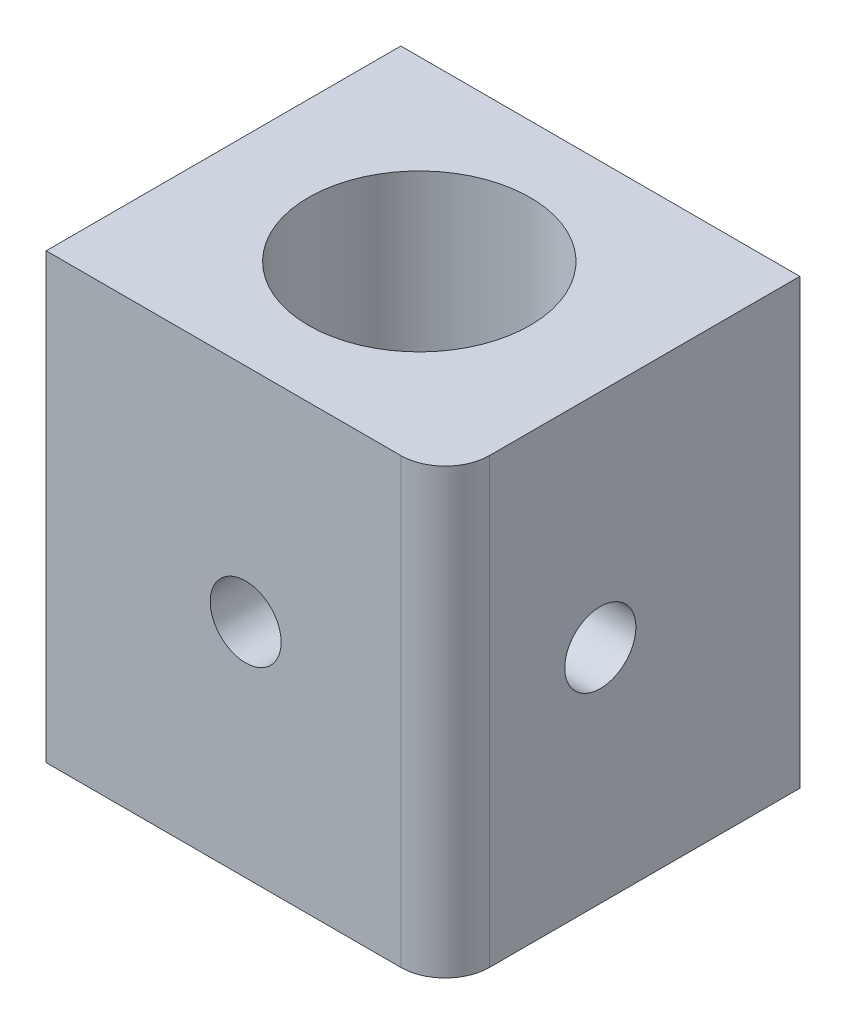
ISO-10303-21;
HEADER;
FILE_DESCRIPTION(('STEP AP214'),'2;1');
FILE_NAME('part.step','',(''),(''),'','','');
FILE_SCHEMA(('AUTOMOTIVE_DESIGN { 1 0 10303 214 1 1 1 1 }'));
ENDSEC;
DATA;
#1=APPLICATION_CONTEXT('core data for automotive mechanical design processes');
#2=APPLICATION_PROTOCOL_DEFINITION('international standard','automotive_design',2000,#1);
#3=PRODUCT_CONTEXT('',#1,'mechanical');
#4=PRODUCT('Part','Part','',(#3));
#5=PRODUCT_RELATED_PRODUCT_CATEGORY('part','',(#4));
#6=PRODUCT_DEFINITION_FORMATION('','',#4);
#7=PRODUCT_DEFINITION_CONTEXT('part definition',#1,'design');
#8=PRODUCT_DEFINITION('design','',#6,#7);
#9=PRODUCT_DEFINITION_SHAPE('','',#8);
#10=(LENGTH_UNIT() NAMED_UNIT(*) SI_UNIT(.MILLI.,.METRE.));
#11=(NAMED_UNIT(*) PLANE_ANGLE_UNIT() SI_UNIT($,.RADIAN.));
#12=(NAMED_UNIT(*) SI_UNIT($,.STERADIAN.) SOLID_ANGLE_UNIT());
#13=UNCERTAINTY_MEASURE_WITH_UNIT(LENGTH_MEASURE(1.E-05),#10,'distance_accuracy_value','');
#14=(GEOMETRIC_REPRESENTATION_CONTEXT(3) GLOBAL_UNCERTAINTY_ASSIGNED_CONTEXT((#13)) GLOBAL_UNIT_ASSIGNED_CONTEXT((#10,
#11,#12)) REPRESENTATION_CONTEXT('',''));
#15=CARTESIAN_POINT('',(0.,0.,0.));
#16=DIRECTION('',(0.,0.,1.));
#17=DIRECTION('',(1.,0.,0.));
#18=AXIS2_PLACEMENT_3D('',#15,#16,#17);
#19=CARTESIAN_POINT('',(0.,20.,0.));
#20=DIRECTION('',(0.,1.,0.));
#21=DIRECTION('',(0.,0.,1.));
#22=AXIS2_PLACEMENT_3D('',#19,#20,#21);
#23=PLANE('',#22);
#24=DIRECTION('',(1.,0.,0.));
#25=VECTOR('',#24,1.);
#26=CARTESIAN_POINT('',(-24.0371296342417,20.,4.76598259989276));
#27=LINE('',#26,#25);
#28=CARTESIAN_POINT('',(-24.0371296342417,20.,4.76598259989276));
#29=VERTEX_POINT('',#28);
#30=CARTESIAN_POINT('',(-8.03712963424174,20.,4.76598259989276));
#31=VERTEX_POINT('',#30);
#32=EDGE_CURVE('E76',#29,#31,#27,.T.);
#33=ORIENTED_EDGE('',*,*,#32,.T.);
#34=CARTESIAN_POINT('',(-8.03712963424174,20.,2.76598259989276));
#35=DIRECTION('',(0.,1.,0.));
#36=DIRECTION('',(0.,0.,1.));
#37=AXIS2_PLACEMENT_3D('',#34,#35,#36);
#38=CIRCLE('',#37,2.);
#39=CARTESIAN_POINT('',(-6.03712963424174,20.,2.76598259989276));
#40=VERTEX_POINT('',#39);
#41=EDGE_CURVE('E11',#31,#40,#38,.T.);
#42=ORIENTED_EDGE('',*,*,#41,.T.);
#43=DIRECTION('',(0.,0.,-1.));
#44=VECTOR('',#43,1.);
#45=CARTESIAN_POINT('',(-6.03712963424174,20.,-11.2340174001072));
#46=LINE('',#45,#44);
#47=CARTESIAN_POINT('',(-6.03712963424174,20.,-11.2340174001072));
#48=VERTEX_POINT('',#47);
#49=EDGE_CURVE('E84',#40,#48,#46,.T.);
#50=ORIENTED_EDGE('',*,*,#49,.T.);
#51=DIRECTION('',(-1.,0.,0.));
#52=VECTOR('',#51,1.);
#53=CARTESIAN_POINT('',(-24.0371296342417,20.,-11.2340174001072));
#54=LINE('',#53,#52);
#55=CARTESIAN_POINT('',(-24.0371296342417,20.,-11.2340174001072));
#56=VERTEX_POINT('',#55);
#57=EDGE_CURVE('E90',#48,#56,#54,.T.);
#58=ORIENTED_EDGE('',*,*,#57,.T.);
#59=DIRECTION('',(0.,0.,1.));
#60=VECTOR('',#59,1.);
#61=CARTESIAN_POINT('',(-24.0371296342417,20.,-11.2340174001072));
#62=LINE('',#61,#60);
#63=EDGE_CURVE('E85',#56,#29,#62,.T.);
#64=ORIENTED_EDGE('',*,*,#63,.T.);
#65=EDGE_LOOP('',(#33,#42,#50,#58,#64));
#66=FACE_BOUND('',#65,.T.);
#67=CARTESIAN_POINT('',(-15.2043179720073,20.,-3.23401740010724));
#68=DIRECTION('',(0.,1.,0.));
#69=DIRECTION('',(0.,0.,1.));
#70=AXIS2_PLACEMENT_3D('',#67,#68,#69);
#71=CIRCLE('',#70,5.);
#72=CARTESIAN_POINT('',(-15.2043179720073,20.,1.76598259989276));
#73=VERTEX_POINT('',#72);
#74=EDGE_CURVE('E222',#73,#73,#71,.T.);
#75=ORIENTED_EDGE('',*,*,#74,.F.);
#76=EDGE_LOOP('',(#75));
#77=FACE_BOUND('',#76,.T.);
#78=ADVANCED_FACE('F33',(#66,#77),#23,.T.);
#79=CARTESIAN_POINT('',(0.,0.,0.));
#80=DIRECTION('',(0.,1.,0.));
#81=DIRECTION('',(0.,0.,1.));
#82=AXIS2_PLACEMENT_3D('',#79,#80,#81);
#83=PLANE('',#82);
#84=DIRECTION('',(0.,0.,-1.));
#85=VECTOR('',#84,1.);
#86=CARTESIAN_POINT('',(-6.03712963424174,0.,-11.2340174001072));
#87=LINE('',#86,#85);
#88=CARTESIAN_POINT('',(-6.03712963424174,0.,2.76598259989276));
#89=VERTEX_POINT('',#88);
#90=CARTESIAN_POINT('',(-6.03712963424174,0.,-11.2340174001072));
#91=VERTEX_POINT('',#90);
#92=EDGE_CURVE('E235',#89,#91,#87,.T.);
#93=ORIENTED_EDGE('',*,*,#92,.F.);
#94=CARTESIAN_POINT('',(-8.03712963424174,0.,2.76598259989276));
#95=DIRECTION('',(0.,1.,0.));
#96=DIRECTION('',(0.,0.,1.));
#97=AXIS2_PLACEMENT_3D('',#94,#95,#96);
#98=CIRCLE('',#97,2.);
#99=CARTESIAN_POINT('',(-8.03712963424174,0.,4.76598259989276));
#100=VERTEX_POINT('',#99);
#101=EDGE_CURVE('E55',#89,#100,#98,.F.);
#102=ORIENTED_EDGE('',*,*,#101,.T.);
#103=DIRECTION('',(1.,0.,0.));
#104=VECTOR('',#103,1.);
#105=CARTESIAN_POINT('',(-24.0371296342417,0.,4.76598259989276));
#106=LINE('',#105,#104);
#107=CARTESIAN_POINT('',(-24.0371296342417,0.,4.76598259989276));
#108=VERTEX_POINT('',#107);
#109=EDGE_CURVE('E233',#108,#100,#106,.T.);
#110=ORIENTED_EDGE('',*,*,#109,.F.);
#111=DIRECTION('',(0.,0.,1.));
#112=VECTOR('',#111,1.);
#113=CARTESIAN_POINT('',(-24.0371296342417,0.,-11.2340174001072));
#114=LINE('',#113,#112);
#115=CARTESIAN_POINT('',(-24.0371296342417,0.,-11.2340174001072));
#116=VERTEX_POINT('',#115);
#117=EDGE_CURVE('E98',#116,#108,#114,.T.);
#118=ORIENTED_EDGE('',*,*,#117,.F.);
#119=DIRECTION('',(-1.,0.,0.));
#120=VECTOR('',#119,1.);
#121=CARTESIAN_POINT('',(-24.0371296342417,0.,-11.2340174001072));
#122=LINE('',#121,#120);
#123=EDGE_CURVE('E94',#91,#116,#122,.T.);
#124=ORIENTED_EDGE('',*,*,#123,.F.);
#125=EDGE_LOOP('',(#93,#102,#110,#118,#124));
#126=FACE_BOUND('',#125,.T.);
#127=CARTESIAN_POINT('',(-15.2043179720073,0.,-3.23401740010724));
#128=DIRECTION('',(0.,1.,0.));
#129=DIRECTION('',(0.,0.,1.));
#130=AXIS2_PLACEMENT_3D('',#127,#128,#129);
#131=CIRCLE('',#130,5.);
#132=CARTESIAN_POINT('',(-15.2043179720073,0.,1.76598259989276));
#133=VERTEX_POINT('',#132);
#134=EDGE_CURVE('E116',#133,#133,#131,.T.);
#135=ORIENTED_EDGE('',*,*,#134,.T.);
#136=EDGE_LOOP('',(#135));
#137=FACE_BOUND('',#136,.T.);
#138=ADVANCED_FACE('F140',(#126,#137),#83,.F.);
#139=CARTESIAN_POINT('',(-24.0371296342417,20.,-11.2340174001072));
#140=DIRECTION('',(1.,0.,0.));
#141=DIRECTION('',(0.,0.,-1.));
#142=AXIS2_PLACEMENT_3D('',#139,#140,#141);
#143=PLANE('',#142);
#144=ORIENTED_EDGE('',*,*,#117,.T.);
#145=DIRECTION('',(0.,-1.,0.));
#146=VECTOR('',#145,1.);
#147=CARTESIAN_POINT('',(-24.0371296342417,20.,4.76598259989276));
#148=LINE('',#147,#146);
#149=EDGE_CURVE('E80',#29,#108,#148,.T.);
#150=ORIENTED_EDGE('',*,*,#149,.F.);
#151=ORIENTED_EDGE('',*,*,#63,.F.);
#152=DIRECTION('',(0.,-1.,0.));
#153=VECTOR('',#152,1.);
#154=CARTESIAN_POINT('',(-24.0371296342417,20.,-11.2340174001072));
#155=LINE('',#154,#153);
#156=EDGE_CURVE('E105',#56,#116,#155,.T.);
#157=ORIENTED_EDGE('',*,*,#156,.T.);
#158=EDGE_LOOP('',(#144,#150,#151,#157));
#159=FACE_BOUND('',#158,.T.);
#160=ADVANCED_FACE('F96',(#159),#143,.F.);
#161=CARTESIAN_POINT('',(-24.0371296342417,20.,4.76598259989276));
#162=DIRECTION('',(0.,0.,-1.));
#163=DIRECTION('',(-1.,0.,0.));
#164=AXIS2_PLACEMENT_3D('',#161,#162,#163);
#165=PLANE('',#164);
#166=CARTESIAN_POINT('',(-15.0371296342417,10.,4.76598259989276));
#167=DIRECTION('',(0.,0.,1.));
#168=DIRECTION('',(1.,0.,0.));
#169=AXIS2_PLACEMENT_3D('',#166,#167,#168);
#170=CIRCLE('',#169,1.6);
#171=CARTESIAN_POINT('',(-13.4371296342417,10.,4.76598259989276));
#172=VERTEX_POINT('',#171);
#173=EDGE_CURVE('E245',#172,#172,#170,.T.);
#174=ORIENTED_EDGE('',*,*,#173,.F.);
#175=EDGE_LOOP('',(#174));
#176=FACE_BOUND('',#175,.T.);
#177=ORIENTED_EDGE('',*,*,#109,.T.);
#178=DIRECTION('',(0.,-1.,0.));
#179=VECTOR('',#178,1.);
#180=CARTESIAN_POINT('',(-8.03712963424174,20.,4.76598259989276));
#181=LINE('',#180,#179);
#182=EDGE_CURVE('E41',#100,#31,#181,.F.);
#183=ORIENTED_EDGE('',*,*,#182,.T.);
#184=ORIENTED_EDGE('',*,*,#32,.F.);
#185=ORIENTED_EDGE('',*,*,#149,.T.);
#186=EDGE_LOOP('',(#177,#183,#184,#185));
#187=FACE_BOUND('',#186,.T.);
#188=ADVANCED_FACE('F78',(#176,#187),#165,.F.);
#189=CARTESIAN_POINT('',(-6.03712963424174,20.,-11.2340174001072));
#190=DIRECTION('',(-1.,0.,0.));
#191=DIRECTION('',(0.,0.,1.));
#192=AXIS2_PLACEMENT_3D('',#189,#190,#191);
#193=PLANE('',#192);
#194=CARTESIAN_POINT('',(-6.03712963424174,10.,-2.23401740010724));
#195=DIRECTION('',(1.,0.,0.));
#196=DIRECTION('',(0.,0.,-1.));
#197=AXIS2_PLACEMENT_3D('',#194,#195,#196);
#198=CIRCLE('',#197,1.605);
#199=CARTESIAN_POINT('',(-6.03712963424174,10.,-3.83901740010724));
#200=VERTEX_POINT('',#199);
#201=EDGE_CURVE('E117',#200,#200,#198,.T.);
#202=ORIENTED_EDGE('',*,*,#201,.F.);
#203=EDGE_LOOP('',(#202));
#204=FACE_BOUND('',#203,.T.);
#205=ORIENTED_EDGE('',*,*,#49,.F.);
#206=DIRECTION('',(0.,-1.,0.));
#207=VECTOR('',#206,1.);
#208=CARTESIAN_POINT('',(-6.03712963424174,20.,2.76598259989276));
#209=LINE('',#208,#207);
#210=EDGE_CURVE('E99',#40,#89,#209,.T.);
#211=ORIENTED_EDGE('',*,*,#210,.T.);
#212=ORIENTED_EDGE('',*,*,#92,.T.);
#213=DIRECTION('',(0.,-1.,0.));
#214=VECTOR('',#213,1.);
#215=CARTESIAN_POINT('',(-6.03712963424174,20.,-11.2340174001072));
#216=LINE('',#215,#214);
#217=EDGE_CURVE('E100',#48,#91,#216,.T.);
#218=ORIENTED_EDGE('',*,*,#217,.F.);
#219=EDGE_LOOP('',(#205,#211,#212,#218));
#220=FACE_BOUND('',#219,.T.);
#221=ADVANCED_FACE('F149',(#204,#220),#193,.F.);
#222=CARTESIAN_POINT('',(-24.0371296342417,20.,-11.2340174001072));
#223=DIRECTION('',(0.,0.,1.));
#224=DIRECTION('',(1.,0.,0.));
#225=AXIS2_PLACEMENT_3D('',#222,#223,#224);
#226=PLANE('',#225);
#227=ORIENTED_EDGE('',*,*,#123,.T.);
#228=ORIENTED_EDGE('',*,*,#156,.F.);
#229=ORIENTED_EDGE('',*,*,#57,.F.);
#230=ORIENTED_EDGE('',*,*,#217,.T.);
#231=EDGE_LOOP('',(#227,#228,#229,#230));
#232=FACE_BOUND('',#231,.T.);
#233=ADVANCED_FACE('F146',(#232),#226,.F.);
#234=CARTESIAN_POINT('',(-15.2043179720073,20.,-3.23401740010724));
#235=DIRECTION('',(0.,-1.,0.));
#236=DIRECTION('',(0.,0.,-1.));
#237=AXIS2_PLACEMENT_3D('',#234,#235,#236);
#238=CYLINDRICAL_SURFACE('',#237,5.);
#239=CARTESIAN_POINT('',(-13.4371296342417,10.,1.44327298844739));
#240=CARTESIAN_POINT('',(-13.4371297978285,9.91330768960326,1.44327321058091));
#241=CARTESIAN_POINT('',(-13.4442008000116,9.82661295536014,1.44596300897748));
#242=CARTESIAN_POINT('',(-13.4721948591757,9.65579895829562,1.45639480744616));
#243=CARTESIAN_POINT('',(-13.4931214782064,9.57168036357674,1.4641381066823));
#244=CARTESIAN_POINT('',(-13.5479792288643,9.40854065917317,1.48375543117041));
#245=CARTESIAN_POINT('',(-13.5818820071374,9.32950887139692,1.49562044514796));
#246=CARTESIAN_POINT('',(-13.6616159834312,9.17824765335041,1.52222382481139));
#247=CARTESIAN_POINT('',(-13.7074497380378,9.10601968553502,1.53696280616484));
#248=CARTESIAN_POINT('',(-13.8118439725969,8.96728310260458,1.56849210846646));
#249=CARTESIAN_POINT('',(-13.8708336685676,8.90111062046994,1.5853402677285));
#250=CARTESIAN_POINT('',(-13.9989264669206,8.77936710681761,1.61896227248119));
#251=CARTESIAN_POINT('',(-14.0680316707358,8.72379828368216,1.63573610178246));
#252=CARTESIAN_POINT('',(-14.217300846121,8.62294893875321,1.66820887241483));
#253=CARTESIAN_POINT('',(-14.297766010703,8.57809382987326,1.68385008056657));
#254=CARTESIAN_POINT('',(-14.4656786027125,8.50269995224867,1.71185403974506));
#255=CARTESIAN_POINT('',(-14.5531245021377,8.47215806050745,1.72421750568548));
#256=CARTESIAN_POINT('',(-14.7297909366968,8.42723189798769,1.74418371296284));
#257=CARTESIAN_POINT('',(-14.8188805464769,8.41239246153338,1.75191756662629));
#258=CARTESIAN_POINT('',(-14.9985627460656,8.39792956760167,1.76255689958001));
#259=CARTESIAN_POINT('',(-15.0891548845081,8.39830162041377,1.76546380329348));
#260=CARTESIAN_POINT('',(-15.2650698923919,8.41396652573768,1.7663540891885));
#261=CARTESIAN_POINT('',(-15.3504505077735,8.42860936608146,1.76454622310554));
#262=CARTESIAN_POINT('',(-15.5175596346818,8.47139715810064,1.75686217172063));
#263=CARTESIAN_POINT('',(-15.5992880664556,8.49954240447214,1.75098589762261));
#264=CARTESIAN_POINT('',(-15.7571433396818,8.5685580926808,1.73596216841026));
#265=CARTESIAN_POINT('',(-15.8332521187056,8.6094675314762,1.72680467567088));
#266=CARTESIAN_POINT('',(-15.9777191105648,8.70281381380134,1.70634508719652));
#267=CARTESIAN_POINT('',(-16.0460755705098,8.75525325655454,1.6950425079707));
#268=CARTESIAN_POINT('',(-16.17593549549,8.8725803313777,1.67113224498378));
#269=CARTESIAN_POINT('',(-16.2370645443493,8.93787585640268,1.65849074379883));
#270=CARTESIAN_POINT('',(-16.3476686631787,9.07780546915048,1.63383309195305));
#271=CARTESIAN_POINT('',(-16.3971420840139,9.15244087607255,1.62181702997171));
#272=CARTESIAN_POINT('',(-16.4837924279344,9.3104917112299,1.59971682051182));
#273=CARTESIAN_POINT('',(-16.5207482895416,9.39403381087474,1.58966860711185));
#274=CARTESIAN_POINT('',(-16.5799783863294,9.56649755800163,1.57311418571265));
#275=CARTESIAN_POINT('',(-16.6022567888972,9.65541767066294,1.56660697240472));
#276=CARTESIAN_POINT('',(-16.6308658966188,9.83312347380873,1.55818235451635));
#277=CARTESIAN_POINT('',(-16.6376763461017,9.92182535635771,1.556126972127));
#278=CARTESIAN_POINT('',(-16.636514402944,10.0991155206637,1.55647472316716));
#279=CARTESIAN_POINT('',(-16.6285440944166,10.1877038166742,1.55887722802666));
#280=CARTESIAN_POINT('',(-16.5985190366197,10.3598661232994,1.56769420429775));
#281=CARTESIAN_POINT('',(-16.5768337141209,10.4435105570392,1.57400335581952));
#282=CARTESIAN_POINT('',(-16.5204356077066,10.6059703709638,1.58974519741327));
#283=CARTESIAN_POINT('',(-16.4857208540458,10.6847850189012,1.59917835973726));
#284=CARTESIAN_POINT('',(-16.4032808097349,10.8374598951514,1.62029356722845));
#285=CARTESIAN_POINT('',(-16.3552613382165,10.9111543354669,1.63202445653823));
#286=CARTESIAN_POINT('',(-16.2478848484674,11.0496442152035,1.65617591839536));
#287=CARTESIAN_POINT('',(-16.1885252896979,11.1144376549162,1.66859664504504));
#288=CARTESIAN_POINT('',(-16.0577489647108,11.2355324394542,1.69307301227166));
#289=CARTESIAN_POINT('',(-15.9859933400676,11.2914741038523,1.70510225162039));
#290=CARTESIAN_POINT('',(-15.8337877784238,11.3905313904881,1.72679574085982));
#291=CARTESIAN_POINT('',(-15.7533386632074,11.4336482235968,1.73646021400731));
#292=CARTESIAN_POINT('',(-15.5870218979065,11.5052272226575,1.75200489967387));
#293=CARTESIAN_POINT('',(-15.5012354081293,11.5338674010917,1.75793131406086));
#294=CARTESIAN_POINT('',(-15.3258886538135,11.5763085755883,1.76527343362268));
#295=CARTESIAN_POINT('',(-15.2363295183397,11.5901139790216,1.76669047876427));
#296=CARTESIAN_POINT('',(-15.0598049176822,11.6021867503085,1.76464248679779));
#297=CARTESIAN_POINT('',(-14.972877273924,11.6010480567704,1.76136865094393));
#298=CARTESIAN_POINT('',(-14.8006321020044,11.5847877051918,1.7504068798384));
#299=CARTESIAN_POINT('',(-14.7153145370809,11.569666366805,1.74271904549558));
#300=CARTESIAN_POINT('',(-14.5490366846159,11.5261451732636,1.72356105593821));
#301=CARTESIAN_POINT('',(-14.4680577819444,11.4978081389078,1.71210886978396));
#302=CARTESIAN_POINT('',(-14.3120237578303,11.4288117558339,1.68635573741275));
#303=CARTESIAN_POINT('',(-14.2369698865903,11.3881498152296,1.67205419220222));
#304=CARTESIAN_POINT('',(-14.091505375896,11.2936874003087,1.64116558534691));
#305=CARTESIAN_POINT('',(-14.0214206786852,11.2394081413975,1.62450790576108));
#306=CARTESIAN_POINT('',(-13.8911613282817,11.1200730345192,1.59093367130789));
#307=CARTESIAN_POINT('',(-13.8309900385605,11.0550135439348,1.57401703069776));
#308=CARTESIAN_POINT('',(-13.7201438233949,10.9131956868645,1.54098976372153));
#309=CARTESIAN_POINT('',(-13.6698743613237,10.8361078805214,1.52492798085902));
#310=CARTESIAN_POINT('',(-13.5831056749187,10.6739859912229,1.49607488316681));
#311=CARTESIAN_POINT('',(-13.5466001787147,10.5889555496067,1.48328207960937));
#312=CARTESIAN_POINT('',(-13.4911327481672,10.4207814439479,1.46340664291538));
#313=CARTESIAN_POINT('',(-13.4709473470338,10.338087347992,1.45593231572115));
#314=CARTESIAN_POINT('',(-13.4439479748076,10.1702623901729,1.44586620649346));
#315=CARTESIAN_POINT('',(-13.4371294735985,10.0851323637872,1.44327277031095));
#316=CARTESIAN_POINT('',(-13.4371296342417,10.,1.44327298844739));
#317=B_SPLINE_CURVE_WITH_KNOTS('',3,(#239,#240,#241,#242,#243,#244,#245,#246,#247,#248,#249,
#250,#251,#252,#253,#254,#255,#256,#257,#258,#259,#260,#261,#262,#263,#264,#265,#266,#267,#268,
#269,#270,#271,#272,#273,#274,#275,#276,#277,#278,#279,#280,#281,#282,#283,#284,#285,#286,#287,
#288,#289,#290,#291,#292,#293,#294,#295,#296,#297,#298,#299,#300,#301,#302,#303,#304,#305,#306,
#307,#308,#309,#310,#311,#312,#313,#314,#315,#316),.UNSPECIFIED.,.T.,.F.,(4,2,2,2,2,2,2,2,2,2,2,
2,2,2,2,2,2,2,2,2,2,2,2,2,2,2,2,2,2,2,2,2,2,2,2,2,2,2,4),(0.,0.259759425520296,
0.519585656829485,0.778847370374539,1.03816468466909,1.30766877841798,1.57722893960732,
1.85617139314305,2.13505295593891,2.40560846041119,2.67608411030117,2.93478948652545,
3.19350050936803,3.45300981226106,3.71257767675686,3.98233631431976,4.25213309667999,
4.52647245507919,4.80073388639105,5.06636555584746,5.33195977361342,5.59068805037071,
5.84945545655801,6.11447718333956,6.37955835316057,6.65357093538655,6.92755763818481,
7.19808788982723,7.46853774543461,7.72827251644347,7.98800134986664,8.24650795329257,
8.50506895754397,8.7744548089226,9.04393187152233,9.32282845661837,9.60159780198451,
9.85676959498431,10.1118548938919),.UNSPECIFIED.);
#318=CARTESIAN_POINT('',(-13.4371296342417,10.,1.44327298844739));
#319=VERTEX_POINT('',#318);
#320=EDGE_CURVE('E118',#319,#319,#317,.T.);
#321=ORIENTED_EDGE('',*,*,#320,.F.);
#322=EDGE_LOOP('',(#321));
#323=FACE_BOUND('',#322,.T.);
#324=CARTESIAN_POINT('',(-10.2410554361343,10.,-3.83901740010724));
#325=CARTESIAN_POINT('',(-10.2410550617484,9.9099767213553,-3.83901681619751));
#326=CARTESIAN_POINT('',(-10.2401120072365,9.81994790970595,-3.83142354524601));
#327=CARTESIAN_POINT('',(-10.2365774992307,9.64245756263025,-3.80127428987307));
#328=CARTESIAN_POINT('',(-10.2339857984032,9.55499641447052,-3.77871606035308));
#329=CARTESIAN_POINT('',(-10.2278349708213,9.38514770816522,-3.71930314905972));
#330=CARTESIAN_POINT('',(-10.2242761910322,9.30275834335976,-3.68245359266048));
#331=CARTESIAN_POINT('',(-10.2172111672369,9.14529977410104,-3.59548803755307));
#332=CARTESIAN_POINT('',(-10.213704925742,9.07023091865287,-3.54537140676016));
#333=CARTESIAN_POINT('',(-10.2079627274658,8.92921728072772,-3.43302046354152));
#334=CARTESIAN_POINT('',(-10.2057319950107,8.86331084815476,-3.37073769670794));
#335=CARTESIAN_POINT('',(-10.2038652530581,8.74289395160999,-3.23595194711327));
#336=CARTESIAN_POINT('',(-10.2042289035819,8.68838199542216,-3.16345030469676));
#337=CARTESIAN_POINT('',(-10.2087037300188,8.59304353144469,-3.01146893109314));
#338=CARTESIAN_POINT('',(-10.2127619727129,8.55203482906957,-2.93210205498619));
#339=CARTESIAN_POINT('',(-10.2254044424685,8.48382329725462,-2.76798913764337));
#340=CARTESIAN_POINT('',(-10.2339877103687,8.45661754442615,-2.68324423972424));
#341=CARTESIAN_POINT('',(-10.2558327167702,8.41710414407201,-2.5131368647855));
#342=CARTESIAN_POINT('',(-10.2689764748081,8.40445260246707,-2.42783871766849));
#343=CARTESIAN_POINT('',(-10.2999034044278,8.3928884115697,-2.25716479119415));
#344=CARTESIAN_POINT('',(-10.3176868793089,8.39397666067048,-2.17178900712539));
#345=CARTESIAN_POINT('',(-10.3576757013584,8.40953415688217,-2.00203759250084));
#346=CARTESIAN_POINT('',(-10.3799410221364,8.42419581768779,-1.91769405549681));
#347=CARTESIAN_POINT('',(-10.4278368886057,8.46633462153229,-1.75328425071444));
#348=CARTESIAN_POINT('',(-10.4534683657954,8.49381531730528,-1.67321917555179));
#349=CARTESIAN_POINT('',(-10.508720908764,8.56283928609446,-1.5138592698282));
#350=CARTESIAN_POINT('',(-10.5384939379689,8.60519627620665,-1.43496981852352));
#351=CARTESIAN_POINT('',(-10.598914262867,8.70220770076061,-1.28548761135581));
#352=CARTESIAN_POINT('',(-10.6295620450545,8.75686909943859,-1.21489958864299));
#353=CARTESIAN_POINT('',(-10.691773925329,8.88124167679092,-1.07928804184063));
#354=CARTESIAN_POINT('',(-10.7232716478329,8.95169076885247,-1.01490727833303));
#355=CARTESIAN_POINT('',(-10.7825476870763,9.10391817760275,-0.899024267603946));
#356=CARTESIAN_POINT('',(-10.8103261010742,9.18569619793087,-0.847521683592836));
#357=CARTESIAN_POINT('',(-10.8584350170452,9.35572219505444,-0.761028536514226));
#358=CARTESIAN_POINT('',(-10.8789955406602,9.44363601664552,-0.725515227078706));
#359=CARTESIAN_POINT('',(-10.9114461005528,9.62578265326872,-0.670367478398624));
#360=CARTESIAN_POINT('',(-10.9233499968135,9.72000510229133,-0.650707650885347));
#361=CARTESIAN_POINT('',(-10.9358572413835,9.89804651313954,-0.630104932455999));
#362=CARTESIAN_POINT('',(-10.9377850205975,9.98152290481335,-0.626967347048799));
#363=CARTESIAN_POINT('',(-10.9336952412185,10.1477483287781,-0.633671476563658));
#364=CARTESIAN_POINT('',(-10.9276792097296,10.2304974977909,-0.6435106968469));
#365=CARTESIAN_POINT('',(-10.9090787166465,10.3870614985193,-0.674484216439104));
#366=CARTESIAN_POINT('',(-10.8969724868463,10.4611000312251,-0.694798522549135));
#367=CARTESIAN_POINT('',(-10.867593123869,10.604620005064,-0.74530946116293));
#368=CARTESIAN_POINT('',(-10.8503186956102,10.6741002986358,-0.775508570845437));
#369=CARTESIAN_POINT('',(-10.8103180142103,10.8128423688905,-0.847681629162164));
#370=CARTESIAN_POINT('',(-10.7872577671516,10.8816050979004,-0.890426146079413));
#371=CARTESIAN_POINT('',(-10.7382939236621,11.0113239616835,-0.985135012307143));
#372=CARTESIAN_POINT('',(-10.7123887696699,11.0722757800852,-1.03710442185741));
#373=CARTESIAN_POINT('',(-10.6557526387789,11.1930791483466,-1.15664397581));
#374=CARTESIAN_POINT('',(-10.6248381798687,11.2517052122794,-1.22536983078749));
#375=CARTESIAN_POINT('',(-10.5633698451881,11.3567252486049,-1.37178535420399));
#376=CARTESIAN_POINT('',(-10.5328161353872,11.4031137854799,-1.44947898389073));
#377=CARTESIAN_POINT('',(-10.4722211624738,11.4846250120067,-1.61673956941849));
#378=CARTESIAN_POINT('',(-10.4423009076558,11.5189860704982,-1.70672487637937));
#379=CARTESIAN_POINT('',(-10.3866452541264,11.571228942511,-1.89259179728742));
#380=CARTESIAN_POINT('',(-10.360908175425,11.5891173850724,-1.98847102277212));
#381=CARTESIAN_POINT('',(-10.3161742866458,11.6066963546818,-2.17806550339542));
#382=CARTESIAN_POINT('',(-10.2968937184757,11.6072963328243,-2.27162846552907));
#383=CARTESIAN_POINT('',(-10.2639362135009,11.5919953043902,-2.45838540237602));
#384=CARTESIAN_POINT('',(-10.2502566171385,11.5761021420951,-2.55157953135765));
#385=CARTESIAN_POINT('',(-10.2292729882649,11.5296754079949,-2.7278059131102));
#386=CARTESIAN_POINT('',(-10.221585013343,11.5002623232854,-2.81108970351638));
#387=CARTESIAN_POINT('',(-10.2105408068611,11.428033228714,-2.97192994853451));
#388=CARTESIAN_POINT('',(-10.2071842471518,11.3852182344902,-3.04948683659852));
#389=CARTESIAN_POINT('',(-10.2039416397313,11.288148034964,-3.19540320225142));
#390=CARTESIAN_POINT('',(-10.2040027345613,11.2340799498361,-3.26388634611973));
#391=CARTESIAN_POINT('',(-10.2063824458385,11.1155972200682,-3.39118233533962));
#392=CARTESIAN_POINT('',(-10.2087013823127,11.051181109778,-3.44999380844538));
#393=CARTESIAN_POINT('',(-10.2145064002546,10.9120462658144,-3.55769504436846));
#394=CARTESIAN_POINT('',(-10.2180194285304,10.837115525074,-3.6063095334204));
#395=CARTESIAN_POINT('',(-10.2250155800197,10.680241030693,-3.6904580365519));
#396=CARTESIAN_POINT('',(-10.2284987045832,10.5982975954984,-3.72599264419973));
#397=CARTESIAN_POINT('',(-10.2344031356327,10.4313835589281,-3.78241386999848));
#398=CARTESIAN_POINT('',(-10.2368450446293,10.3465115405755,-3.80359013209784));
#399=CARTESIAN_POINT('',(-10.2401713453774,10.1744280173774,-3.83189190161267));
#400=CARTESIAN_POINT('',(-10.241055798848,10.0872166053765,-3.83901796581231));
#401=CARTESIAN_POINT('',(-10.2410554361343,10.,-3.83901740010724));
#402=B_SPLINE_CURVE_WITH_KNOTS('',3,(#324,#325,#326,#327,#328,#329,#330,#331,#332,#333,#334,
#335,#336,#337,#338,#339,#340,#341,#342,#343,#344,#345,#346,#347,#348,#349,#350,#351,#352,#353,
#354,#355,#356,#357,#358,#359,#360,#361,#362,#363,#364,#365,#366,#367,#368,#369,#370,#371,#372,
#373,#374,#375,#376,#377,#378,#379,#380,#381,#382,#383,#384,#385,#386,#387,#388,#389,#390,#391,
#392,#393,#394,#395,#396,#397,#398,#399,#400,#401),.UNSPECIFIED.,.T.,.F.,(4,2,2,2,2,2,2,2,2,2,2,
2,2,2,2,2,2,2,2,2,2,2,2,2,2,2,2,2,2,2,2,2,2,2,2,2,2,2,4),(0.,0.26975830983304,0.539557098962411,
0.809259218068096,1.07897418893583,1.3497861078698,1.62056253913392,1.88751952293533,
2.15441994309129,2.4148752713206,2.67534762983178,2.93956987292552,3.20386538749394,
3.48573864165354,3.76777183766633,4.06780690393926,4.36783412288657,4.65717591743844,
4.94605342549884,5.19536621117958,5.44463107638415,5.67681908616689,5.90906532797495,
6.16063263927781,6.41233837464308,6.69753512284009,6.98285833382914,7.28390367108036,
7.58482780627642,7.86989135162392,8.15481938036775,8.41950233373323,8.68416523346208,
8.94473600453837,9.20534371434439,9.47227294553878,9.73919006192451,10.0005484218347,
10.2618964243731),.UNSPECIFIED.);
#403=CARTESIAN_POINT('',(-10.2410554361343,10.,-3.83901740010724));
#404=VERTEX_POINT('',#403);
#405=EDGE_CURVE('E109',#404,#404,#402,.T.);
#406=ORIENTED_EDGE('',*,*,#405,.F.);
#407=EDGE_LOOP('',(#406));
#408=FACE_BOUND('',#407,.T.);
#409=ORIENTED_EDGE('',*,*,#74,.T.);
#410=EDGE_LOOP('',(#409));
#411=FACE_BOUND('',#410,.T.);
#412=ORIENTED_EDGE('',*,*,#134,.F.);
#413=EDGE_LOOP('',(#412));
#414=FACE_BOUND('',#413,.T.);
#415=ADVANCED_FACE('F122',(#323,#408,#411,#414),#238,.F.);
#416=CARTESIAN_POINT('',(-16.0371296342417,10.,-2.23401740010724));
#417=DIRECTION('',(1.,0.,0.));
#418=DIRECTION('',(0.,0.,-1.));
#419=AXIS2_PLACEMENT_3D('',#416,#417,#418);
#420=CYLINDRICAL_SURFACE('',#419,1.605);
#421=ORIENTED_EDGE('',*,*,#405,.T.);
#422=EDGE_LOOP('',(#421));
#423=FACE_BOUND('',#422,.T.);
#424=ORIENTED_EDGE('',*,*,#201,.T.);
#425=EDGE_LOOP('',(#424));
#426=FACE_BOUND('',#425,.T.);
#427=ADVANCED_FACE('F125',(#423,#426),#420,.F.);
#428=CARTESIAN_POINT('',(-15.0371296342417,10.,-5.23401740010724));
#429=DIRECTION('',(0.,0.,1.));
#430=DIRECTION('',(1.,0.,0.));
#431=AXIS2_PLACEMENT_3D('',#428,#429,#430);
#432=CYLINDRICAL_SURFACE('',#431,1.6);
#433=ORIENTED_EDGE('',*,*,#320,.T.);
#434=EDGE_LOOP('',(#433));
#435=FACE_BOUND('',#434,.T.);
#436=ORIENTED_EDGE('',*,*,#173,.T.);
#437=EDGE_LOOP('',(#436));
#438=FACE_BOUND('',#437,.T.);
#439=ADVANCED_FACE('F128',(#435,#438),#432,.F.);
#440=CARTESIAN_POINT('',(-8.03712963424174,20.,2.76598259989276));
#441=DIRECTION('',(0.,-1.,0.));
#442=DIRECTION('',(0.,0.,-1.));
#443=AXIS2_PLACEMENT_3D('',#440,#441,#442);
#444=CYLINDRICAL_SURFACE('',#443,2.);
#445=ORIENTED_EDGE('',*,*,#41,.F.);
#446=ORIENTED_EDGE('',*,*,#182,.F.);
#447=ORIENTED_EDGE('',*,*,#101,.F.);
#448=ORIENTED_EDGE('',*,*,#210,.F.);
#449=EDGE_LOOP('',(#445,#446,#447,#448));
#450=FACE_BOUND('',#449,.T.);
#451=ADVANCED_FACE('F35',(#450),#444,.T.);
#452=CLOSED_SHELL('',(#78,#138,#160,#188,#221,#233,#415,#427,#439,#451));
#453=MANIFOLD_SOLID_BREP('B2',#452);
#454=ADVANCED_BREP_SHAPE_REPRESENTATION('',(#18,#453),#14);
#455=SHAPE_DEFINITION_REPRESENTATION(#9,#454);
ENDSEC;
END-ISO-10303-21;
